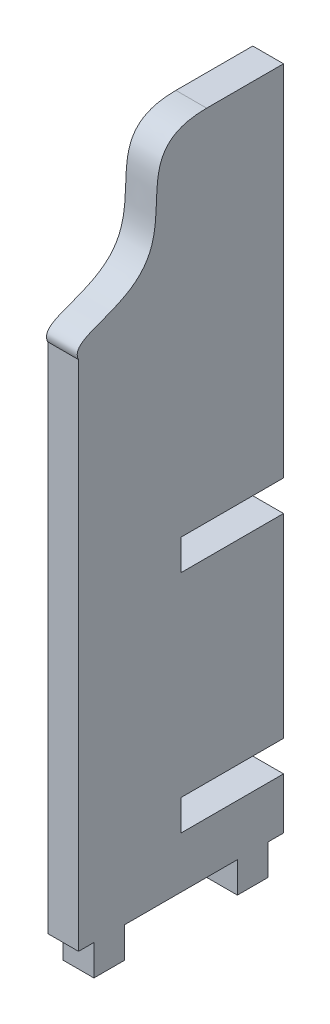
ISO-10303-21;
HEADER;
FILE_DESCRIPTION(('STEP AP214'),'2;1');
FILE_NAME('part.step','',(''),(''),'','','');
FILE_SCHEMA(('AUTOMOTIVE_DESIGN { 1 0 10303 214 1 1 1 1 }'));
ENDSEC;
DATA;
#1=APPLICATION_CONTEXT('core data for automotive mechanical design processes');
#2=APPLICATION_PROTOCOL_DEFINITION('international standard','automotive_design',2000,#1);
#3=PRODUCT_CONTEXT('',#1,'mechanical');
#4=PRODUCT('Part','Part','',(#3));
#5=PRODUCT_RELATED_PRODUCT_CATEGORY('part','',(#4));
#6=PRODUCT_DEFINITION_FORMATION('','',#4);
#7=PRODUCT_DEFINITION_CONTEXT('part definition',#1,'design');
#8=PRODUCT_DEFINITION('design','',#6,#7);
#9=PRODUCT_DEFINITION_SHAPE('','',#8);
#10=(LENGTH_UNIT() NAMED_UNIT(*) SI_UNIT(.MILLI.,.METRE.));
#11=(NAMED_UNIT(*) PLANE_ANGLE_UNIT() SI_UNIT($,.RADIAN.));
#12=(NAMED_UNIT(*) SI_UNIT($,.STERADIAN.) SOLID_ANGLE_UNIT());
#13=UNCERTAINTY_MEASURE_WITH_UNIT(LENGTH_MEASURE(1.E-05),#10,'distance_accuracy_value','');
#14=(GEOMETRIC_REPRESENTATION_CONTEXT(3) GLOBAL_UNCERTAINTY_ASSIGNED_CONTEXT((#13)) GLOBAL_UNIT_ASSIGNED_CONTEXT((#10,
#11,#12)) REPRESENTATION_CONTEXT('',''));
#15=CARTESIAN_POINT('',(0.,0.,0.));
#16=DIRECTION('',(0.,0.,1.));
#17=DIRECTION('',(1.,0.,0.));
#18=AXIS2_PLACEMENT_3D('',#15,#16,#17);
#19=CARTESIAN_POINT('',(6.,30.,0.));
#20=DIRECTION('',(0.,-1.,0.));
#21=DIRECTION('',(0.,0.,-1.));
#22=AXIS2_PLACEMENT_3D('',#19,#20,#21);
#23=PLANE('',#22);
#24=DIRECTION('',(0.,0.,1.));
#25=VECTOR('',#24,1.);
#26=CARTESIAN_POINT('',(0.,30.,0.));
#27=LINE('',#26,#25);
#28=CARTESIAN_POINT('',(0.,30.,0.));
#29=VERTEX_POINT('',#28);
#30=CARTESIAN_POINT('',(0.,30.,15.));
#31=VERTEX_POINT('',#30);
#32=EDGE_CURVE('E211',#29,#31,#27,.T.);
#33=ORIENTED_EDGE('',*,*,#32,.T.);
#34=DIRECTION('',(-1.,0.,0.));
#35=VECTOR('',#34,1.);
#36=CARTESIAN_POINT('',(6.,30.,15.));
#37=LINE('',#36,#35);
#38=CARTESIAN_POINT('',(6.,30.,15.));
#39=VERTEX_POINT('',#38);
#40=EDGE_CURVE('E41',#39,#31,#37,.T.);
#41=ORIENTED_EDGE('',*,*,#40,.F.);
#42=DIRECTION('',(0.,0.,1.));
#43=VECTOR('',#42,1.);
#44=CARTESIAN_POINT('',(6.,30.,0.));
#45=LINE('',#44,#43);
#46=CARTESIAN_POINT('',(6.,30.,0.));
#47=VERTEX_POINT('',#46);
#48=EDGE_CURVE('E132',#47,#39,#45,.T.);
#49=ORIENTED_EDGE('',*,*,#48,.F.);
#50=DIRECTION('',(-1.,0.,0.));
#51=VECTOR('',#50,1.);
#52=CARTESIAN_POINT('',(6.,30.,0.));
#53=LINE('',#52,#51);
#54=EDGE_CURVE('E11',#47,#29,#53,.T.);
#55=ORIENTED_EDGE('',*,*,#54,.T.);
#56=EDGE_LOOP('',(#33,#41,#49,#55));
#57=FACE_BOUND('',#56,.T.);
#58=ADVANCED_FACE('F33',(#57),#23,.F.);
#59=CARTESIAN_POINT('',(6.,30.,15.));
#60=CARTESIAN_POINT('',(6.,30.,26.592384509037));
#61=CARTESIAN_POINT('',(6.,22.8625619518326,32.6543123441638));
#62=CARTESIAN_POINT('',(6.,0.,7.32724241085236));
#63=CARTESIAN_POINT('',(6.,8.08089202622853,43.9263462601289));
#64=CARTESIAN_POINT('',(6.,0.,40.));
#65=B_SPLINE_CURVE_WITH_KNOTS('',5,(#59,#60,#61,#62,#63,#64),.UNSPECIFIED.,.F.,.F.,(6,6),(0.,
1.),.UNSPECIFIED.);
#66=DIRECTION('',(-1.,0.,0.));
#67=VECTOR('',#66,1.);
#68=SURFACE_OF_LINEAR_EXTRUSION('',#65,#67);
#69=CARTESIAN_POINT('',(0.,30.,15.));
#70=CARTESIAN_POINT('',(0.,30.,26.592384509037));
#71=CARTESIAN_POINT('',(0.,22.8625619518326,32.6543123441638));
#72=CARTESIAN_POINT('',(0.,0.,7.32724241085236));
#73=CARTESIAN_POINT('',(0.,8.08089202622853,43.9263462601289));
#74=CARTESIAN_POINT('',(0.,0.,40.));
#75=B_SPLINE_CURVE_WITH_KNOTS('',5,(#69,#70,#71,#72,#73,#74),.UNSPECIFIED.,.F.,.F.,(6,6),(0.,
1.),.UNSPECIFIED.);
#76=CARTESIAN_POINT('',(0.,0.,40.));
#77=VERTEX_POINT('',#76);
#78=EDGE_CURVE('E213',#31,#77,#75,.T.);
#79=ORIENTED_EDGE('',*,*,#78,.T.);
#80=DIRECTION('',(-1.,0.,0.));
#81=VECTOR('',#80,1.);
#82=CARTESIAN_POINT('',(6.,0.,40.));
#83=LINE('',#82,#81);
#84=CARTESIAN_POINT('',(6.,0.,40.));
#85=VERTEX_POINT('',#84);
#86=EDGE_CURVE('E300',#85,#77,#83,.T.);
#87=ORIENTED_EDGE('',*,*,#86,.F.);
#88=EDGE_CURVE('E308',#39,#85,#65,.T.);
#89=ORIENTED_EDGE('',*,*,#88,.F.);
#90=ORIENTED_EDGE('',*,*,#40,.T.);
#91=EDGE_LOOP('',(#79,#87,#89,#90));
#92=FACE_BOUND('',#91,.T.);
#93=ADVANCED_FACE('F306',(#92),#68,.F.);
#94=CARTESIAN_POINT('',(6.,0.,40.));
#95=DIRECTION('',(0.,0.,-1.));
#96=DIRECTION('',(0.,1.,0.));
#97=AXIS2_PLACEMENT_3D('',#94,#95,#96);
#98=PLANE('',#97);
#99=DIRECTION('',(0.,-1.,0.));
#100=VECTOR('',#99,1.);
#101=CARTESIAN_POINT('',(0.,0.,40.));
#102=LINE('',#101,#100);
#103=CARTESIAN_POINT('',(0.,-100.,40.));
#104=VERTEX_POINT('',#103);
#105=EDGE_CURVE('E217',#77,#104,#102,.T.);
#106=ORIENTED_EDGE('',*,*,#105,.T.);
#107=DIRECTION('',(-1.,0.,0.));
#108=VECTOR('',#107,1.);
#109=CARTESIAN_POINT('',(6.,-100.,40.));
#110=LINE('',#109,#108);
#111=CARTESIAN_POINT('',(6.,-100.,40.));
#112=VERTEX_POINT('',#111);
#113=EDGE_CURVE('E297',#112,#104,#110,.T.);
#114=ORIENTED_EDGE('',*,*,#113,.F.);
#115=DIRECTION('',(0.,-1.,0.));
#116=VECTOR('',#115,1.);
#117=CARTESIAN_POINT('',(6.,0.,40.));
#118=LINE('',#117,#116);
#119=EDGE_CURVE('E327',#85,#112,#118,.T.);
#120=ORIENTED_EDGE('',*,*,#119,.F.);
#121=ORIENTED_EDGE('',*,*,#86,.T.);
#122=EDGE_LOOP('',(#106,#114,#120,#121));
#123=FACE_BOUND('',#122,.T.);
#124=ADVANCED_FACE('F318',(#123),#98,.F.);
#125=CARTESIAN_POINT('',(6.,-100.,40.));
#126=DIRECTION('',(0.,1.,0.));
#127=DIRECTION('',(0.,0.,1.));
#128=AXIS2_PLACEMENT_3D('',#125,#126,#127);
#129=PLANE('',#128);
#130=DIRECTION('',(0.,0.,-1.));
#131=VECTOR('',#130,1.);
#132=CARTESIAN_POINT('',(0.,-100.,40.));
#133=LINE('',#132,#131);
#134=CARTESIAN_POINT('',(0.,-100.,37.));
#135=VERTEX_POINT('',#134);
#136=EDGE_CURVE('E222',#104,#135,#133,.T.);
#137=ORIENTED_EDGE('',*,*,#136,.T.);
#138=DIRECTION('',(-1.,0.,0.));
#139=VECTOR('',#138,1.);
#140=CARTESIAN_POINT('',(6.,-100.,37.));
#141=LINE('',#140,#139);
#142=CARTESIAN_POINT('',(6.,-100.,37.));
#143=VERTEX_POINT('',#142);
#144=EDGE_CURVE('E294',#143,#135,#141,.T.);
#145=ORIENTED_EDGE('',*,*,#144,.F.);
#146=DIRECTION('',(0.,0.,-1.));
#147=VECTOR('',#146,1.);
#148=CARTESIAN_POINT('',(6.,-100.,40.));
#149=LINE('',#148,#147);
#150=EDGE_CURVE('E324',#112,#143,#149,.T.);
#151=ORIENTED_EDGE('',*,*,#150,.F.);
#152=ORIENTED_EDGE('',*,*,#113,.T.);
#153=EDGE_LOOP('',(#137,#145,#151,#152));
#154=FACE_BOUND('',#153,.T.);
#155=ADVANCED_FACE('F322',(#154),#129,.F.);
#156=CARTESIAN_POINT('',(6.,-106.,37.));
#157=DIRECTION('',(0.,0.,-1.));
#158=DIRECTION('',(-1.,0.,0.));
#159=AXIS2_PLACEMENT_3D('',#156,#157,#158);
#160=PLANE('',#159);
#161=DIRECTION('',(0.,-1.,0.));
#162=VECTOR('',#161,1.);
#163=CARTESIAN_POINT('',(0.,-106.,37.));
#164=LINE('',#163,#162);
#165=CARTESIAN_POINT('',(0.,-106.,37.));
#166=VERTEX_POINT('',#165);
#167=EDGE_CURVE('E224',#135,#166,#164,.T.);
#168=ORIENTED_EDGE('',*,*,#167,.T.);
#169=DIRECTION('',(-1.,0.,0.));
#170=VECTOR('',#169,1.);
#171=CARTESIAN_POINT('',(6.,-106.,37.));
#172=LINE('',#171,#170);
#173=CARTESIAN_POINT('',(6.,-106.,37.));
#174=VERTEX_POINT('',#173);
#175=EDGE_CURVE('E291',#174,#166,#172,.T.);
#176=ORIENTED_EDGE('',*,*,#175,.F.);
#177=DIRECTION('',(0.,-1.,0.));
#178=VECTOR('',#177,1.);
#179=CARTESIAN_POINT('',(6.,-106.,37.));
#180=LINE('',#179,#178);
#181=EDGE_CURVE('E326',#143,#174,#180,.T.);
#182=ORIENTED_EDGE('',*,*,#181,.F.);
#183=ORIENTED_EDGE('',*,*,#144,.T.);
#184=EDGE_LOOP('',(#168,#176,#182,#183));
#185=FACE_BOUND('',#184,.T.);
#186=ADVANCED_FACE('F380',(#185),#160,.F.);
#187=CARTESIAN_POINT('',(6.,-106.,31.));
#188=DIRECTION('',(0.,1.,0.));
#189=DIRECTION('',(0.,0.,1.));
#190=AXIS2_PLACEMENT_3D('',#187,#188,#189);
#191=PLANE('',#190);
#192=DIRECTION('',(0.,0.,-1.));
#193=VECTOR('',#192,1.);
#194=CARTESIAN_POINT('',(0.,-106.,31.));
#195=LINE('',#194,#193);
#196=CARTESIAN_POINT('',(0.,-106.,31.));
#197=VERTEX_POINT('',#196);
#198=EDGE_CURVE('E226',#166,#197,#195,.T.);
#199=ORIENTED_EDGE('',*,*,#198,.T.);
#200=DIRECTION('',(-1.,0.,0.));
#201=VECTOR('',#200,1.);
#202=CARTESIAN_POINT('',(6.,-106.,31.));
#203=LINE('',#202,#201);
#204=CARTESIAN_POINT('',(6.,-106.,31.));
#205=VERTEX_POINT('',#204);
#206=EDGE_CURVE('E288',#205,#197,#203,.T.);
#207=ORIENTED_EDGE('',*,*,#206,.F.);
#208=DIRECTION('',(0.,0.,-1.));
#209=VECTOR('',#208,1.);
#210=CARTESIAN_POINT('',(6.,-106.,31.));
#211=LINE('',#210,#209);
#212=EDGE_CURVE('E329',#174,#205,#211,.T.);
#213=ORIENTED_EDGE('',*,*,#212,.F.);
#214=ORIENTED_EDGE('',*,*,#175,.T.);
#215=EDGE_LOOP('',(#199,#207,#213,#214));
#216=FACE_BOUND('',#215,.T.);
#217=ADVANCED_FACE('F383',(#216),#191,.F.);
#218=CARTESIAN_POINT('',(6.,-100.,31.));
#219=DIRECTION('',(0.,0.,1.));
#220=DIRECTION('',(1.,0.,0.));
#221=AXIS2_PLACEMENT_3D('',#218,#219,#220);
#222=PLANE('',#221);
#223=DIRECTION('',(0.,1.,0.));
#224=VECTOR('',#223,1.);
#225=CARTESIAN_POINT('',(0.,-100.,31.));
#226=LINE('',#225,#224);
#227=CARTESIAN_POINT('',(0.,-100.,31.));
#228=VERTEX_POINT('',#227);
#229=EDGE_CURVE('E228',#197,#228,#226,.T.);
#230=ORIENTED_EDGE('',*,*,#229,.T.);
#231=DIRECTION('',(-1.,0.,0.));
#232=VECTOR('',#231,1.);
#233=CARTESIAN_POINT('',(6.,-100.,31.));
#234=LINE('',#233,#232);
#235=CARTESIAN_POINT('',(6.,-100.,31.));
#236=VERTEX_POINT('',#235);
#237=EDGE_CURVE('E285',#236,#228,#234,.T.);
#238=ORIENTED_EDGE('',*,*,#237,.F.);
#239=DIRECTION('',(0.,1.,0.));
#240=VECTOR('',#239,1.);
#241=CARTESIAN_POINT('',(6.,-100.,31.));
#242=LINE('',#241,#240);
#243=EDGE_CURVE('E335',#205,#236,#242,.T.);
#244=ORIENTED_EDGE('',*,*,#243,.F.);
#245=ORIENTED_EDGE('',*,*,#206,.T.);
#246=EDGE_LOOP('',(#230,#238,#244,#245));
#247=FACE_BOUND('',#246,.T.);
#248=ADVANCED_FACE('F387',(#247),#222,.F.);
#249=CARTESIAN_POINT('',(6.,-100.,31.));
#250=DIRECTION('',(0.,1.,0.));
#251=DIRECTION('',(0.,0.,1.));
#252=AXIS2_PLACEMENT_3D('',#249,#250,#251);
#253=PLANE('',#252);
#254=DIRECTION('',(0.,0.,-1.));
#255=VECTOR('',#254,1.);
#256=CARTESIAN_POINT('',(0.,-100.,31.));
#257=LINE('',#256,#255);
#258=CARTESIAN_POINT('',(0.,-100.,9.));
#259=VERTEX_POINT('',#258);
#260=EDGE_CURVE('E230',#228,#259,#257,.T.);
#261=ORIENTED_EDGE('',*,*,#260,.T.);
#262=DIRECTION('',(-1.,0.,0.));
#263=VECTOR('',#262,1.);
#264=CARTESIAN_POINT('',(6.,-100.,9.));
#265=LINE('',#264,#263);
#266=CARTESIAN_POINT('',(6.,-100.,9.));
#267=VERTEX_POINT('',#266);
#268=EDGE_CURVE('E282',#267,#259,#265,.T.);
#269=ORIENTED_EDGE('',*,*,#268,.F.);
#270=DIRECTION('',(0.,0.,-1.));
#271=VECTOR('',#270,1.);
#272=CARTESIAN_POINT('',(6.,-100.,31.));
#273=LINE('',#272,#271);
#274=EDGE_CURVE('E337',#236,#267,#273,.T.);
#275=ORIENTED_EDGE('',*,*,#274,.F.);
#276=ORIENTED_EDGE('',*,*,#237,.T.);
#277=EDGE_LOOP('',(#261,#269,#275,#276));
#278=FACE_BOUND('',#277,.T.);
#279=ADVANCED_FACE('F391',(#278),#253,.F.);
#280=CARTESIAN_POINT('',(6.,-106.,9.));
#281=DIRECTION('',(0.,0.,-1.));
#282=DIRECTION('',(-1.,0.,0.));
#283=AXIS2_PLACEMENT_3D('',#280,#281,#282);
#284=PLANE('',#283);
#285=DIRECTION('',(0.,-1.,0.));
#286=VECTOR('',#285,1.);
#287=CARTESIAN_POINT('',(0.,-106.,9.));
#288=LINE('',#287,#286);
#289=CARTESIAN_POINT('',(0.,-106.,9.));
#290=VERTEX_POINT('',#289);
#291=EDGE_CURVE('E232',#259,#290,#288,.T.);
#292=ORIENTED_EDGE('',*,*,#291,.T.);
#293=DIRECTION('',(-1.,0.,0.));
#294=VECTOR('',#293,1.);
#295=CARTESIAN_POINT('',(6.,-106.,9.));
#296=LINE('',#295,#294);
#297=CARTESIAN_POINT('',(6.,-106.,9.));
#298=VERTEX_POINT('',#297);
#299=EDGE_CURVE('E279',#298,#290,#296,.T.);
#300=ORIENTED_EDGE('',*,*,#299,.F.);
#301=DIRECTION('',(0.,-1.,0.));
#302=VECTOR('',#301,1.);
#303=CARTESIAN_POINT('',(6.,-106.,9.));
#304=LINE('',#303,#302);
#305=EDGE_CURVE('E339',#267,#298,#304,.T.);
#306=ORIENTED_EDGE('',*,*,#305,.F.);
#307=ORIENTED_EDGE('',*,*,#268,.T.);
#308=EDGE_LOOP('',(#292,#300,#306,#307));
#309=FACE_BOUND('',#308,.T.);
#310=ADVANCED_FACE('F395',(#309),#284,.F.);
#311=CARTESIAN_POINT('',(6.,-106.,3.));
#312=DIRECTION('',(0.,1.,0.));
#313=DIRECTION('',(0.,0.,1.));
#314=AXIS2_PLACEMENT_3D('',#311,#312,#313);
#315=PLANE('',#314);
#316=DIRECTION('',(0.,0.,-1.));
#317=VECTOR('',#316,1.);
#318=CARTESIAN_POINT('',(0.,-106.,3.));
#319=LINE('',#318,#317);
#320=CARTESIAN_POINT('',(0.,-106.,3.));
#321=VERTEX_POINT('',#320);
#322=EDGE_CURVE('E234',#290,#321,#319,.T.);
#323=ORIENTED_EDGE('',*,*,#322,.T.);
#324=DIRECTION('',(-1.,0.,0.));
#325=VECTOR('',#324,1.);
#326=CARTESIAN_POINT('',(6.,-106.,3.));
#327=LINE('',#326,#325);
#328=CARTESIAN_POINT('',(6.,-106.,3.));
#329=VERTEX_POINT('',#328);
#330=EDGE_CURVE('E276',#329,#321,#327,.T.);
#331=ORIENTED_EDGE('',*,*,#330,.F.);
#332=DIRECTION('',(0.,0.,-1.));
#333=VECTOR('',#332,1.);
#334=CARTESIAN_POINT('',(6.,-106.,3.));
#335=LINE('',#334,#333);
#336=EDGE_CURVE('E341',#298,#329,#335,.T.);
#337=ORIENTED_EDGE('',*,*,#336,.F.);
#338=ORIENTED_EDGE('',*,*,#299,.T.);
#339=EDGE_LOOP('',(#323,#331,#337,#338));
#340=FACE_BOUND('',#339,.T.);
#341=ADVANCED_FACE('F399',(#340),#315,.F.);
#342=CARTESIAN_POINT('',(6.,-100.,3.));
#343=DIRECTION('',(0.,0.,1.));
#344=DIRECTION('',(0.,-1.,0.));
#345=AXIS2_PLACEMENT_3D('',#342,#343,#344);
#346=PLANE('',#345);
#347=DIRECTION('',(0.,1.,0.));
#348=VECTOR('',#347,1.);
#349=CARTESIAN_POINT('',(0.,-100.,3.));
#350=LINE('',#349,#348);
#351=CARTESIAN_POINT('',(0.,-100.,3.));
#352=VERTEX_POINT('',#351);
#353=EDGE_CURVE('E236',#321,#352,#350,.T.);
#354=ORIENTED_EDGE('',*,*,#353,.T.);
#355=DIRECTION('',(-1.,0.,0.));
#356=VECTOR('',#355,1.);
#357=CARTESIAN_POINT('',(6.,-100.,3.));
#358=LINE('',#357,#356);
#359=CARTESIAN_POINT('',(6.,-100.,3.));
#360=VERTEX_POINT('',#359);
#361=EDGE_CURVE('E273',#360,#352,#358,.T.);
#362=ORIENTED_EDGE('',*,*,#361,.F.);
#363=DIRECTION('',(0.,1.,0.));
#364=VECTOR('',#363,1.);
#365=CARTESIAN_POINT('',(6.,-100.,3.));
#366=LINE('',#365,#364);
#367=EDGE_CURVE('E343',#329,#360,#366,.T.);
#368=ORIENTED_EDGE('',*,*,#367,.F.);
#369=ORIENTED_EDGE('',*,*,#330,.T.);
#370=EDGE_LOOP('',(#354,#362,#368,#369));
#371=FACE_BOUND('',#370,.T.);
#372=ADVANCED_FACE('F403',(#371),#346,.F.);
#373=CARTESIAN_POINT('',(6.,-100.,3.));
#374=DIRECTION('',(0.,1.,0.));
#375=DIRECTION('',(0.,0.,1.));
#376=AXIS2_PLACEMENT_3D('',#373,#374,#375);
#377=PLANE('',#376);
#378=DIRECTION('',(0.,0.,-1.));
#379=VECTOR('',#378,1.);
#380=CARTESIAN_POINT('',(0.,-100.,3.));
#381=LINE('',#380,#379);
#382=CARTESIAN_POINT('',(0.,-100.,0.));
#383=VERTEX_POINT('',#382);
#384=EDGE_CURVE('E238',#352,#383,#381,.T.);
#385=ORIENTED_EDGE('',*,*,#384,.T.);
#386=DIRECTION('',(-1.,0.,0.));
#387=VECTOR('',#386,1.);
#388=CARTESIAN_POINT('',(6.,-100.,0.));
#389=LINE('',#388,#387);
#390=CARTESIAN_POINT('',(6.,-100.,0.));
#391=VERTEX_POINT('',#390);
#392=EDGE_CURVE('E270',#391,#383,#389,.T.);
#393=ORIENTED_EDGE('',*,*,#392,.F.);
#394=DIRECTION('',(0.,0.,-1.));
#395=VECTOR('',#394,1.);
#396=CARTESIAN_POINT('',(6.,-100.,3.));
#397=LINE('',#396,#395);
#398=EDGE_CURVE('E345',#360,#391,#397,.T.);
#399=ORIENTED_EDGE('',*,*,#398,.F.);
#400=ORIENTED_EDGE('',*,*,#361,.T.);
#401=EDGE_LOOP('',(#385,#393,#399,#400));
#402=FACE_BOUND('',#401,.T.);
#403=ADVANCED_FACE('F407',(#402),#377,.F.);
#404=CARTESIAN_POINT('',(6.,-90.,0.));
#405=DIRECTION('',(0.,0.,1.));
#406=DIRECTION('',(1.,0.,0.));
#407=AXIS2_PLACEMENT_3D('',#404,#405,#406);
#408=PLANE('',#407);
#409=DIRECTION('',(0.,1.,0.));
#410=VECTOR('',#409,1.);
#411=CARTESIAN_POINT('',(0.,-90.,0.));
#412=LINE('',#411,#410);
#413=CARTESIAN_POINT('',(0.,-90.,0.));
#414=VERTEX_POINT('',#413);
#415=EDGE_CURVE('E240',#383,#414,#412,.T.);
#416=ORIENTED_EDGE('',*,*,#415,.T.);
#417=DIRECTION('',(-1.,0.,0.));
#418=VECTOR('',#417,1.);
#419=CARTESIAN_POINT('',(6.,-90.,0.));
#420=LINE('',#419,#418);
#421=CARTESIAN_POINT('',(6.,-90.,0.));
#422=VERTEX_POINT('',#421);
#423=EDGE_CURVE('E267',#422,#414,#420,.T.);
#424=ORIENTED_EDGE('',*,*,#423,.F.);
#425=DIRECTION('',(0.,1.,0.));
#426=VECTOR('',#425,1.);
#427=CARTESIAN_POINT('',(6.,-90.,0.));
#428=LINE('',#427,#426);
#429=EDGE_CURVE('E347',#391,#422,#428,.T.);
#430=ORIENTED_EDGE('',*,*,#429,.F.);
#431=ORIENTED_EDGE('',*,*,#392,.T.);
#432=EDGE_LOOP('',(#416,#424,#430,#431));
#433=FACE_BOUND('',#432,.T.);
#434=ADVANCED_FACE('F411',(#433),#408,.F.);
#435=CARTESIAN_POINT('',(6.,-90.,20.));
#436=DIRECTION('',(0.,-1.,0.));
#437=DIRECTION('',(0.,0.,-1.));
#438=AXIS2_PLACEMENT_3D('',#435,#436,#437);
#439=PLANE('',#438);
#440=DIRECTION('',(0.,0.,1.));
#441=VECTOR('',#440,1.);
#442=CARTESIAN_POINT('',(0.,-90.,20.));
#443=LINE('',#442,#441);
#444=CARTESIAN_POINT('',(0.,-90.,20.));
#445=VERTEX_POINT('',#444);
#446=EDGE_CURVE('E242',#414,#445,#443,.T.);
#447=ORIENTED_EDGE('',*,*,#446,.T.);
#448=DIRECTION('',(-1.,0.,0.));
#449=VECTOR('',#448,1.);
#450=CARTESIAN_POINT('',(6.,-90.,20.));
#451=LINE('',#450,#449);
#452=CARTESIAN_POINT('',(6.,-90.,20.));
#453=VERTEX_POINT('',#452);
#454=EDGE_CURVE('E264',#453,#445,#451,.T.);
#455=ORIENTED_EDGE('',*,*,#454,.F.);
#456=DIRECTION('',(0.,0.,1.));
#457=VECTOR('',#456,1.);
#458=CARTESIAN_POINT('',(6.,-90.,20.));
#459=LINE('',#458,#457);
#460=EDGE_CURVE('E349',#422,#453,#459,.T.);
#461=ORIENTED_EDGE('',*,*,#460,.F.);
#462=ORIENTED_EDGE('',*,*,#423,.T.);
#463=EDGE_LOOP('',(#447,#455,#461,#462));
#464=FACE_BOUND('',#463,.T.);
#465=ADVANCED_FACE('F415',(#464),#439,.F.);
#466=CARTESIAN_POINT('',(6.,-84.,20.));
#467=DIRECTION('',(0.,0.,1.));
#468=DIRECTION('',(1.,0.,0.));
#469=AXIS2_PLACEMENT_3D('',#466,#467,#468);
#470=PLANE('',#469);
#471=DIRECTION('',(0.,1.,0.));
#472=VECTOR('',#471,1.);
#473=CARTESIAN_POINT('',(0.,-84.,20.));
#474=LINE('',#473,#472);
#475=CARTESIAN_POINT('',(0.,-84.,20.));
#476=VERTEX_POINT('',#475);
#477=EDGE_CURVE('E244',#445,#476,#474,.T.);
#478=ORIENTED_EDGE('',*,*,#477,.T.);
#479=DIRECTION('',(-1.,0.,0.));
#480=VECTOR('',#479,1.);
#481=CARTESIAN_POINT('',(6.,-84.,20.));
#482=LINE('',#481,#480);
#483=CARTESIAN_POINT('',(6.,-84.,20.));
#484=VERTEX_POINT('',#483);
#485=EDGE_CURVE('E261',#484,#476,#482,.T.);
#486=ORIENTED_EDGE('',*,*,#485,.F.);
#487=DIRECTION('',(0.,1.,0.));
#488=VECTOR('',#487,1.);
#489=CARTESIAN_POINT('',(6.,-84.,20.));
#490=LINE('',#489,#488);
#491=EDGE_CURVE('E351',#453,#484,#490,.T.);
#492=ORIENTED_EDGE('',*,*,#491,.F.);
#493=ORIENTED_EDGE('',*,*,#454,.T.);
#494=EDGE_LOOP('',(#478,#486,#492,#493));
#495=FACE_BOUND('',#494,.T.);
#496=ADVANCED_FACE('F419',(#495),#470,.F.);
#497=CARTESIAN_POINT('',(6.,-84.,0.));
#498=DIRECTION('',(0.,1.,0.));
#499=DIRECTION('',(0.,0.,1.));
#500=AXIS2_PLACEMENT_3D('',#497,#498,#499);
#501=PLANE('',#500);
#502=DIRECTION('',(0.,0.,-1.));
#503=VECTOR('',#502,1.);
#504=CARTESIAN_POINT('',(0.,-84.,0.));
#505=LINE('',#504,#503);
#506=CARTESIAN_POINT('',(0.,-84.,0.));
#507=VERTEX_POINT('',#506);
#508=EDGE_CURVE('E246',#476,#507,#505,.T.);
#509=ORIENTED_EDGE('',*,*,#508,.T.);
#510=DIRECTION('',(-1.,0.,0.));
#511=VECTOR('',#510,1.);
#512=CARTESIAN_POINT('',(6.,-84.,0.));
#513=LINE('',#512,#511);
#514=CARTESIAN_POINT('',(6.,-84.,0.));
#515=VERTEX_POINT('',#514);
#516=EDGE_CURVE('E258',#515,#507,#513,.T.);
#517=ORIENTED_EDGE('',*,*,#516,.F.);
#518=DIRECTION('',(0.,0.,-1.));
#519=VECTOR('',#518,1.);
#520=CARTESIAN_POINT('',(6.,-84.,0.));
#521=LINE('',#520,#519);
#522=EDGE_CURVE('E353',#484,#515,#521,.T.);
#523=ORIENTED_EDGE('',*,*,#522,.F.);
#524=ORIENTED_EDGE('',*,*,#485,.T.);
#525=EDGE_LOOP('',(#509,#517,#523,#524));
#526=FACE_BOUND('',#525,.T.);
#527=ADVANCED_FACE('F359',(#526),#501,.F.);
#528=CARTESIAN_POINT('',(6.,-84.,0.));
#529=DIRECTION('',(0.,0.,1.));
#530=DIRECTION('',(0.,-1.,0.));
#531=AXIS2_PLACEMENT_3D('',#528,#529,#530);
#532=PLANE('',#531);
#533=DIRECTION('',(0.,1.,0.));
#534=VECTOR('',#533,1.);
#535=CARTESIAN_POINT('',(0.,-84.,0.));
#536=LINE('',#535,#534);
#537=CARTESIAN_POINT('',(0.,-46.,0.));
#538=VERTEX_POINT('',#537);
#539=EDGE_CURVE('E248',#507,#538,#536,.T.);
#540=ORIENTED_EDGE('',*,*,#539,.T.);
#541=DIRECTION('',(-1.,0.,0.));
#542=VECTOR('',#541,1.);
#543=CARTESIAN_POINT('',(6.,-46.,0.));
#544=LINE('',#543,#542);
#545=CARTESIAN_POINT('',(6.,-46.,0.));
#546=VERTEX_POINT('',#545);
#547=EDGE_CURVE('E200',#546,#538,#544,.T.);
#548=ORIENTED_EDGE('',*,*,#547,.F.);
#549=DIRECTION('',(0.,1.,0.));
#550=VECTOR('',#549,1.);
#551=CARTESIAN_POINT('',(6.,-84.,0.));
#552=LINE('',#551,#550);
#553=EDGE_CURVE('E191',#515,#546,#552,.T.);
#554=ORIENTED_EDGE('',*,*,#553,.F.);
#555=ORIENTED_EDGE('',*,*,#516,.T.);
#556=EDGE_LOOP('',(#540,#548,#554,#555));
#557=FACE_BOUND('',#556,.T.);
#558=ADVANCED_FACE('F363',(#557),#532,.F.);
#559=CARTESIAN_POINT('',(6.,-46.,20.));
#560=DIRECTION('',(0.,-1.,0.));
#561=DIRECTION('',(0.,0.,-1.));
#562=AXIS2_PLACEMENT_3D('',#559,#560,#561);
#563=PLANE('',#562);
#564=DIRECTION('',(0.,0.,1.));
#565=VECTOR('',#564,1.);
#566=CARTESIAN_POINT('',(0.,-46.,20.));
#567=LINE('',#566,#565);
#568=CARTESIAN_POINT('',(0.,-46.,20.));
#569=VERTEX_POINT('',#568);
#570=EDGE_CURVE('E199',#538,#569,#567,.T.);
#571=ORIENTED_EDGE('',*,*,#570,.T.);
#572=DIRECTION('',(-1.,0.,0.));
#573=VECTOR('',#572,1.);
#574=CARTESIAN_POINT('',(6.,-46.,20.));
#575=LINE('',#574,#573);
#576=CARTESIAN_POINT('',(6.,-46.,20.));
#577=VERTEX_POINT('',#576);
#578=EDGE_CURVE('E196',#577,#569,#575,.T.);
#579=ORIENTED_EDGE('',*,*,#578,.F.);
#580=DIRECTION('',(0.,0.,1.));
#581=VECTOR('',#580,1.);
#582=CARTESIAN_POINT('',(6.,-46.,20.));
#583=LINE('',#582,#581);
#584=EDGE_CURVE('E185',#546,#577,#583,.T.);
#585=ORIENTED_EDGE('',*,*,#584,.F.);
#586=ORIENTED_EDGE('',*,*,#547,.T.);
#587=EDGE_LOOP('',(#571,#579,#585,#586));
#588=FACE_BOUND('',#587,.T.);
#589=ADVANCED_FACE('F197',(#588),#563,.F.);
#590=CARTESIAN_POINT('',(6.,-40.,20.));
#591=DIRECTION('',(0.,0.,1.));
#592=DIRECTION('',(0.,-1.,0.));
#593=AXIS2_PLACEMENT_3D('',#590,#591,#592);
#594=PLANE('',#593);
#595=DIRECTION('',(0.,1.,0.));
#596=VECTOR('',#595,1.);
#597=CARTESIAN_POINT('',(0.,-40.,20.));
#598=LINE('',#597,#596);
#599=CARTESIAN_POINT('',(0.,-40.,20.));
#600=VERTEX_POINT('',#599);
#601=EDGE_CURVE('E118',#569,#600,#598,.T.);
#602=ORIENTED_EDGE('',*,*,#601,.T.);
#603=DIRECTION('',(-1.,0.,0.));
#604=VECTOR('',#603,1.);
#605=CARTESIAN_POINT('',(6.,-40.,20.));
#606=LINE('',#605,#604);
#607=CARTESIAN_POINT('',(6.,-40.,20.));
#608=VERTEX_POINT('',#607);
#609=EDGE_CURVE('E201',#608,#600,#606,.T.);
#610=ORIENTED_EDGE('',*,*,#609,.F.);
#611=DIRECTION('',(0.,1.,0.));
#612=VECTOR('',#611,1.);
#613=CARTESIAN_POINT('',(6.,-40.,20.));
#614=LINE('',#613,#612);
#615=EDGE_CURVE('E189',#577,#608,#614,.T.);
#616=ORIENTED_EDGE('',*,*,#615,.F.);
#617=ORIENTED_EDGE('',*,*,#578,.T.);
#618=EDGE_LOOP('',(#602,#610,#616,#617));
#619=FACE_BOUND('',#618,.T.);
#620=ADVANCED_FACE('F203',(#619),#594,.F.);
#621=CARTESIAN_POINT('',(6.,-40.,0.));
#622=DIRECTION('',(0.,1.,0.));
#623=DIRECTION('',(0.,0.,1.));
#624=AXIS2_PLACEMENT_3D('',#621,#622,#623);
#625=PLANE('',#624);
#626=DIRECTION('',(0.,0.,-1.));
#627=VECTOR('',#626,1.);
#628=CARTESIAN_POINT('',(0.,-40.,0.));
#629=LINE('',#628,#627);
#630=CARTESIAN_POINT('',(0.,-40.,0.));
#631=VERTEX_POINT('',#630);
#632=EDGE_CURVE('E125',#600,#631,#629,.T.);
#633=ORIENTED_EDGE('',*,*,#632,.T.);
#634=DIRECTION('',(-1.,0.,0.));
#635=VECTOR('',#634,1.);
#636=CARTESIAN_POINT('',(6.,-40.,0.));
#637=LINE('',#636,#635);
#638=CARTESIAN_POINT('',(6.,-40.,0.));
#639=VERTEX_POINT('',#638);
#640=EDGE_CURVE('E207',#639,#631,#637,.T.);
#641=ORIENTED_EDGE('',*,*,#640,.F.);
#642=DIRECTION('',(0.,0.,-1.));
#643=VECTOR('',#642,1.);
#644=CARTESIAN_POINT('',(6.,-40.,0.));
#645=LINE('',#644,#643);
#646=EDGE_CURVE('E205',#608,#639,#645,.T.);
#647=ORIENTED_EDGE('',*,*,#646,.F.);
#648=ORIENTED_EDGE('',*,*,#609,.T.);
#649=EDGE_LOOP('',(#633,#641,#647,#648));
#650=FACE_BOUND('',#649,.T.);
#651=ADVANCED_FACE('F365',(#650),#625,.F.);
#652=CARTESIAN_POINT('',(6.,-40.,0.));
#653=DIRECTION('',(0.,0.,1.));
#654=DIRECTION('',(0.,-1.,0.));
#655=AXIS2_PLACEMENT_3D('',#652,#653,#654);
#656=PLANE('',#655);
#657=DIRECTION('',(0.,1.,0.));
#658=VECTOR('',#657,1.);
#659=CARTESIAN_POINT('',(0.,-40.,0.));
#660=LINE('',#659,#658);
#661=EDGE_CURVE('E253',#631,#29,#660,.T.);
#662=ORIENTED_EDGE('',*,*,#661,.T.);
#663=ORIENTED_EDGE('',*,*,#54,.F.);
#664=DIRECTION('',(0.,1.,0.));
#665=VECTOR('',#664,1.);
#666=CARTESIAN_POINT('',(6.,0.,0.));
#667=LINE('',#666,#665);
#668=EDGE_CURVE('E49',#639,#47,#667,.T.);
#669=ORIENTED_EDGE('',*,*,#668,.F.);
#670=ORIENTED_EDGE('',*,*,#640,.T.);
#671=EDGE_LOOP('',(#662,#663,#669,#670));
#672=FACE_BOUND('',#671,.T.);
#673=ADVANCED_FACE('F364',(#672),#656,.F.);
#674=CARTESIAN_POINT('',(6.,14.0321899890459,25.2315375436247));
#675=DIRECTION('',(-1.,0.,0.));
#676=DIRECTION('',(0.,0.,1.));
#677=AXIS2_PLACEMENT_3D('',#674,#675,#676);
#678=PLANE('',#677);
#679=ORIENTED_EDGE('',*,*,#668,.T.);
#680=ORIENTED_EDGE('',*,*,#48,.T.);
#681=ORIENTED_EDGE('',*,*,#88,.T.);
#682=ORIENTED_EDGE('',*,*,#119,.T.);
#683=ORIENTED_EDGE('',*,*,#150,.T.);
#684=ORIENTED_EDGE('',*,*,#181,.T.);
#685=ORIENTED_EDGE('',*,*,#212,.T.);
#686=ORIENTED_EDGE('',*,*,#243,.T.);
#687=ORIENTED_EDGE('',*,*,#274,.T.);
#688=ORIENTED_EDGE('',*,*,#305,.T.);
#689=ORIENTED_EDGE('',*,*,#336,.T.);
#690=ORIENTED_EDGE('',*,*,#367,.T.);
#691=ORIENTED_EDGE('',*,*,#398,.T.);
#692=ORIENTED_EDGE('',*,*,#429,.T.);
#693=ORIENTED_EDGE('',*,*,#460,.T.);
#694=ORIENTED_EDGE('',*,*,#491,.T.);
#695=ORIENTED_EDGE('',*,*,#522,.T.);
#696=ORIENTED_EDGE('',*,*,#553,.T.);
#697=ORIENTED_EDGE('',*,*,#584,.T.);
#698=ORIENTED_EDGE('',*,*,#615,.T.);
#699=ORIENTED_EDGE('',*,*,#646,.T.);
#700=EDGE_LOOP('',(#679,#680,#681,#682,#683,#684,#685,#686,#687,#688,#689,#690,#691,#692,#693,
#694,#695,#696,#697,#698,#699));
#701=FACE_BOUND('',#700,.T.);
#702=ADVANCED_FACE('F187',(#701),#678,.F.);
#703=CARTESIAN_POINT('',(0.,14.0321899890459,25.2315375436247));
#704=DIRECTION('',(-1.,0.,0.));
#705=DIRECTION('',(0.,0.,1.));
#706=AXIS2_PLACEMENT_3D('',#703,#704,#705);
#707=PLANE('',#706);
#708=ORIENTED_EDGE('',*,*,#32,.F.);
#709=ORIENTED_EDGE('',*,*,#661,.F.);
#710=ORIENTED_EDGE('',*,*,#632,.F.);
#711=ORIENTED_EDGE('',*,*,#601,.F.);
#712=ORIENTED_EDGE('',*,*,#570,.F.);
#713=ORIENTED_EDGE('',*,*,#539,.F.);
#714=ORIENTED_EDGE('',*,*,#508,.F.);
#715=ORIENTED_EDGE('',*,*,#477,.F.);
#716=ORIENTED_EDGE('',*,*,#446,.F.);
#717=ORIENTED_EDGE('',*,*,#415,.F.);
#718=ORIENTED_EDGE('',*,*,#384,.F.);
#719=ORIENTED_EDGE('',*,*,#353,.F.);
#720=ORIENTED_EDGE('',*,*,#322,.F.);
#721=ORIENTED_EDGE('',*,*,#291,.F.);
#722=ORIENTED_EDGE('',*,*,#260,.F.);
#723=ORIENTED_EDGE('',*,*,#229,.F.);
#724=ORIENTED_EDGE('',*,*,#198,.F.);
#725=ORIENTED_EDGE('',*,*,#167,.F.);
#726=ORIENTED_EDGE('',*,*,#136,.F.);
#727=ORIENTED_EDGE('',*,*,#105,.F.);
#728=ORIENTED_EDGE('',*,*,#78,.F.);
#729=EDGE_LOOP('',(#708,#709,#710,#711,#712,#713,#714,#715,#716,#717,#718,#719,#720,#721,#722,
#723,#724,#725,#726,#727,#728));
#730=FACE_BOUND('',#729,.T.);
#731=ADVANCED_FACE('F312',(#730),#707,.T.);
#732=CLOSED_SHELL('',(#58,#93,#124,#155,#186,#217,#248,#279,#310,#341,#372,#403,#434,#465,#496,
#527,#558,#589,#620,#651,#673,#702,#731));
#733=MANIFOLD_SOLID_BREP('B2',#732);
#734=ADVANCED_BREP_SHAPE_REPRESENTATION('',(#18,#733),#14);
#735=SHAPE_DEFINITION_REPRESENTATION(#9,#734);
ENDSEC;
END-ISO-10303-21;
